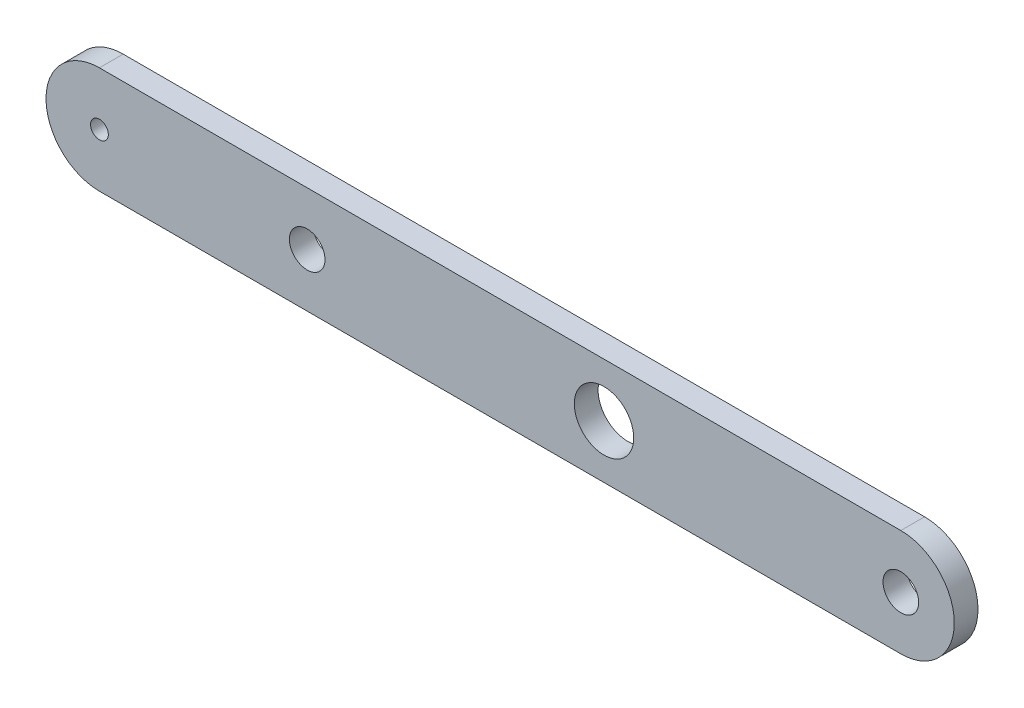
ISO-10303-21;
HEADER;
FILE_DESCRIPTION(('STEP AP214'),'2;1');
FILE_NAME('part.step','',(''),(''),'','','');
FILE_SCHEMA(('AUTOMOTIVE_DESIGN { 1 0 10303 214 1 1 1 1 }'));
ENDSEC;
DATA;
#1=APPLICATION_CONTEXT('core data for automotive mechanical design processes');
#2=APPLICATION_PROTOCOL_DEFINITION('international standard','automotive_design',2000,#1);
#3=PRODUCT_CONTEXT('',#1,'mechanical');
#4=PRODUCT('Part','Part','',(#3));
#5=PRODUCT_RELATED_PRODUCT_CATEGORY('part','',(#4));
#6=PRODUCT_DEFINITION_FORMATION('','',#4);
#7=PRODUCT_DEFINITION_CONTEXT('part definition',#1,'design');
#8=PRODUCT_DEFINITION('design','',#6,#7);
#9=PRODUCT_DEFINITION_SHAPE('','',#8);
#10=(LENGTH_UNIT() NAMED_UNIT(*) SI_UNIT(.MILLI.,.METRE.));
#11=(NAMED_UNIT(*) PLANE_ANGLE_UNIT() SI_UNIT($,.RADIAN.));
#12=(NAMED_UNIT(*) SI_UNIT($,.STERADIAN.) SOLID_ANGLE_UNIT());
#13=UNCERTAINTY_MEASURE_WITH_UNIT(LENGTH_MEASURE(1.E-05),#10,'distance_accuracy_value','');
#14=(GEOMETRIC_REPRESENTATION_CONTEXT(3) GLOBAL_UNCERTAINTY_ASSIGNED_CONTEXT((#13)) GLOBAL_UNIT_ASSIGNED_CONTEXT((#10,
#11,#12)) REPRESENTATION_CONTEXT('',''));
#15=CARTESIAN_POINT('',(0.,0.,0.));
#16=DIRECTION('',(0.,0.,1.));
#17=DIRECTION('',(1.,0.,0.));
#18=AXIS2_PLACEMENT_3D('',#15,#16,#17);
#19=CARTESIAN_POINT('',(-35.,0.,4.));
#20=DIRECTION('',(0.,0.,1.));
#21=DIRECTION('',(1.,0.,0.));
#22=AXIS2_PLACEMENT_3D('',#19,#20,#21);
#23=PLANE('',#22);
#24=CARTESIAN_POINT('',(50.,0.,4.));
#25=DIRECTION('',(0.,0.,1.));
#26=DIRECTION('',(1.,0.,0.));
#27=AXIS2_PLACEMENT_3D('',#24,#25,#26);
#28=CIRCLE('',#27,5.);
#29=CARTESIAN_POINT('',(55.,0.,4.));
#30=VERTEX_POINT('',#29);
#31=EDGE_CURVE('E123',#30,#30,#28,.T.);
#32=ORIENTED_EDGE('',*,*,#31,.F.);
#33=EDGE_LOOP('',(#32));
#34=FACE_BOUND('',#33,.T.);
#35=CARTESIAN_POINT('',(100.,0.,4.));
#36=DIRECTION('',(0.,0.,1.));
#37=DIRECTION('',(1.,0.,0.));
#38=AXIS2_PLACEMENT_3D('',#35,#36,#37);
#39=CIRCLE('',#38,3.00000000000001);
#40=CARTESIAN_POINT('',(103.,0.,4.));
#41=VERTEX_POINT('',#40);
#42=EDGE_CURVE('E102',#41,#41,#39,.T.);
#43=ORIENTED_EDGE('',*,*,#42,.F.);
#44=EDGE_LOOP('',(#43));
#45=FACE_BOUND('',#44,.T.);
#46=CARTESIAN_POINT('',(-35.,0.,4.));
#47=DIRECTION('',(0.,0.,1.));
#48=DIRECTION('',(1.,0.,0.));
#49=AXIS2_PLACEMENT_3D('',#46,#47,#48);
#50=CIRCLE('',#49,9.);
#51=CARTESIAN_POINT('',(-35.,9.,4.));
#52=VERTEX_POINT('',#51);
#53=CARTESIAN_POINT('',(-35.,-9.,4.));
#54=VERTEX_POINT('',#53);
#55=EDGE_CURVE('E87',#52,#54,#50,.T.);
#56=ORIENTED_EDGE('',*,*,#55,.T.);
#57=DIRECTION('',(1.,0.,0.));
#58=VECTOR('',#57,1.);
#59=CARTESIAN_POINT('',(-35.,-9.,4.));
#60=LINE('',#59,#58);
#61=CARTESIAN_POINT('',(100.,-9.,4.));
#62=VERTEX_POINT('',#61);
#63=EDGE_CURVE('E82',#54,#62,#60,.T.);
#64=ORIENTED_EDGE('',*,*,#63,.T.);
#65=CARTESIAN_POINT('',(100.,0.,4.));
#66=DIRECTION('',(0.,0.,1.));
#67=DIRECTION('',(1.,0.,0.));
#68=AXIS2_PLACEMENT_3D('',#65,#66,#67);
#69=CIRCLE('',#68,9.);
#70=CARTESIAN_POINT('',(100.,9.,4.));
#71=VERTEX_POINT('',#70);
#72=EDGE_CURVE('E85',#62,#71,#69,.T.);
#73=ORIENTED_EDGE('',*,*,#72,.T.);
#74=DIRECTION('',(-1.,0.,0.));
#75=VECTOR('',#74,1.);
#76=CARTESIAN_POINT('',(-35.,9.,4.));
#77=LINE('',#76,#75);
#78=EDGE_CURVE('E52',#71,#52,#77,.T.);
#79=ORIENTED_EDGE('',*,*,#78,.T.);
#80=EDGE_LOOP('',(#56,#64,#73,#79));
#81=FACE_BOUND('',#80,.T.);
#82=CARTESIAN_POINT('',(0.,0.,4.));
#83=DIRECTION('',(0.,0.,1.));
#84=DIRECTION('',(1.,0.,0.));
#85=AXIS2_PLACEMENT_3D('',#82,#83,#84);
#86=CIRCLE('',#85,3.);
#87=CARTESIAN_POINT('',(3.,0.,4.));
#88=VERTEX_POINT('',#87);
#89=EDGE_CURVE('E117',#88,#88,#86,.T.);
#90=ORIENTED_EDGE('',*,*,#89,.F.);
#91=EDGE_LOOP('',(#90));
#92=FACE_BOUND('',#91,.T.);
#93=CARTESIAN_POINT('',(-35.,0.,4.));
#94=DIRECTION('',(0.,0.,1.));
#95=DIRECTION('',(1.,0.,0.));
#96=AXIS2_PLACEMENT_3D('',#93,#94,#95);
#97=CIRCLE('',#96,1.5);
#98=CARTESIAN_POINT('',(-33.5,0.,4.));
#99=VERTEX_POINT('',#98);
#100=EDGE_CURVE('E129',#99,#99,#97,.T.);
#101=ORIENTED_EDGE('',*,*,#100,.F.);
#102=EDGE_LOOP('',(#101));
#103=FACE_BOUND('',#102,.T.);
#104=ADVANCED_FACE('F35',(#34,#45,#81,#92,#103),#23,.T.);
#105=CARTESIAN_POINT('',(-35.,0.,0.));
#106=DIRECTION('',(0.,0.,1.));
#107=DIRECTION('',(1.,0.,0.));
#108=AXIS2_PLACEMENT_3D('',#105,#106,#107);
#109=PLANE('',#108);
#110=CARTESIAN_POINT('',(-35.,0.,0.));
#111=DIRECTION('',(0.,0.,1.));
#112=DIRECTION('',(1.,0.,0.));
#113=AXIS2_PLACEMENT_3D('',#110,#111,#112);
#114=CIRCLE('',#113,9.);
#115=CARTESIAN_POINT('',(-35.,9.,0.));
#116=VERTEX_POINT('',#115);
#117=CARTESIAN_POINT('',(-35.,-9.,0.));
#118=VERTEX_POINT('',#117);
#119=EDGE_CURVE('E99',#116,#118,#114,.T.);
#120=ORIENTED_EDGE('',*,*,#119,.F.);
#121=DIRECTION('',(-1.,0.,0.));
#122=VECTOR('',#121,1.);
#123=CARTESIAN_POINT('',(-35.,9.,0.));
#124=LINE('',#123,#122);
#125=CARTESIAN_POINT('',(100.,9.,0.));
#126=VERTEX_POINT('',#125);
#127=EDGE_CURVE('E75',#126,#116,#124,.T.);
#128=ORIENTED_EDGE('',*,*,#127,.F.);
#129=CARTESIAN_POINT('',(100.,0.,0.));
#130=DIRECTION('',(0.,0.,1.));
#131=DIRECTION('',(1.,0.,0.));
#132=AXIS2_PLACEMENT_3D('',#129,#130,#131);
#133=CIRCLE('',#132,9.);
#134=CARTESIAN_POINT('',(100.,-9.,0.));
#135=VERTEX_POINT('',#134);
#136=EDGE_CURVE('E69',#135,#126,#133,.T.);
#137=ORIENTED_EDGE('',*,*,#136,.F.);
#138=DIRECTION('',(1.,0.,0.));
#139=VECTOR('',#138,1.);
#140=CARTESIAN_POINT('',(-35.,-9.,0.));
#141=LINE('',#140,#139);
#142=EDGE_CURVE('E91',#118,#135,#141,.T.);
#143=ORIENTED_EDGE('',*,*,#142,.F.);
#144=EDGE_LOOP('',(#120,#128,#137,#143));
#145=FACE_BOUND('',#144,.T.);
#146=CARTESIAN_POINT('',(100.,0.,0.));
#147=DIRECTION('',(0.,0.,1.));
#148=DIRECTION('',(1.,0.,0.));
#149=AXIS2_PLACEMENT_3D('',#146,#147,#148);
#150=CIRCLE('',#149,3.00000000000001);
#151=CARTESIAN_POINT('',(103.,0.,0.));
#152=VERTEX_POINT('',#151);
#153=EDGE_CURVE('E114',#152,#152,#150,.T.);
#154=ORIENTED_EDGE('',*,*,#153,.T.);
#155=EDGE_LOOP('',(#154));
#156=FACE_BOUND('',#155,.T.);
#157=CARTESIAN_POINT('',(0.,0.,0.));
#158=DIRECTION('',(0.,0.,1.));
#159=DIRECTION('',(1.,0.,0.));
#160=AXIS2_PLACEMENT_3D('',#157,#158,#159);
#161=CIRCLE('',#160,3.);
#162=CARTESIAN_POINT('',(3.,0.,0.));
#163=VERTEX_POINT('',#162);
#164=EDGE_CURVE('E120',#163,#163,#161,.T.);
#165=ORIENTED_EDGE('',*,*,#164,.T.);
#166=EDGE_LOOP('',(#165));
#167=FACE_BOUND('',#166,.T.);
#168=CARTESIAN_POINT('',(50.,0.,0.));
#169=DIRECTION('',(0.,0.,1.));
#170=DIRECTION('',(1.,0.,0.));
#171=AXIS2_PLACEMENT_3D('',#168,#169,#170);
#172=CIRCLE('',#171,5.);
#173=CARTESIAN_POINT('',(55.,0.,0.));
#174=VERTEX_POINT('',#173);
#175=EDGE_CURVE('E126',#174,#174,#172,.T.);
#176=ORIENTED_EDGE('',*,*,#175,.T.);
#177=EDGE_LOOP('',(#176));
#178=FACE_BOUND('',#177,.T.);
#179=CARTESIAN_POINT('',(-35.,0.,0.));
#180=DIRECTION('',(0.,0.,1.));
#181=DIRECTION('',(1.,0.,0.));
#182=AXIS2_PLACEMENT_3D('',#179,#180,#181);
#183=CIRCLE('',#182,1.5);
#184=CARTESIAN_POINT('',(-33.5,0.,0.));
#185=VERTEX_POINT('',#184);
#186=EDGE_CURVE('E132',#185,#185,#183,.T.);
#187=ORIENTED_EDGE('',*,*,#186,.T.);
#188=EDGE_LOOP('',(#187));
#189=FACE_BOUND('',#188,.T.);
#190=ADVANCED_FACE('F110',(#145,#156,#167,#178,#189),#109,.F.);
#191=CARTESIAN_POINT('',(-35.,0.,4.));
#192=DIRECTION('',(0.,0.,-1.));
#193=DIRECTION('',(-1.,0.,0.));
#194=AXIS2_PLACEMENT_3D('',#191,#192,#193);
#195=CYLINDRICAL_SURFACE('',#194,9.);
#196=ORIENTED_EDGE('',*,*,#119,.T.);
#197=DIRECTION('',(0.,0.,-1.));
#198=VECTOR('',#197,1.);
#199=CARTESIAN_POINT('',(-35.,-9.,4.));
#200=LINE('',#199,#198);
#201=EDGE_CURVE('E11',#54,#118,#200,.T.);
#202=ORIENTED_EDGE('',*,*,#201,.F.);
#203=ORIENTED_EDGE('',*,*,#55,.F.);
#204=DIRECTION('',(0.,0.,-1.));
#205=VECTOR('',#204,1.);
#206=CARTESIAN_POINT('',(-35.,9.,4.));
#207=LINE('',#206,#205);
#208=EDGE_CURVE('E95',#52,#116,#207,.T.);
#209=ORIENTED_EDGE('',*,*,#208,.T.);
#210=EDGE_LOOP('',(#196,#202,#203,#209));
#211=FACE_BOUND('',#210,.T.);
#212=ADVANCED_FACE('F37',(#211),#195,.T.);
#213=CARTESIAN_POINT('',(-35.,-9.,4.));
#214=DIRECTION('',(0.,1.,0.));
#215=DIRECTION('',(-1.,0.,0.));
#216=AXIS2_PLACEMENT_3D('',#213,#214,#215);
#217=PLANE('',#216);
#218=ORIENTED_EDGE('',*,*,#142,.T.);
#219=DIRECTION('',(0.,0.,-1.));
#220=VECTOR('',#219,1.);
#221=CARTESIAN_POINT('',(100.,-9.,4.));
#222=LINE('',#221,#220);
#223=EDGE_CURVE('E44',#62,#135,#222,.T.);
#224=ORIENTED_EDGE('',*,*,#223,.F.);
#225=ORIENTED_EDGE('',*,*,#63,.F.);
#226=ORIENTED_EDGE('',*,*,#201,.T.);
#227=EDGE_LOOP('',(#218,#224,#225,#226));
#228=FACE_BOUND('',#227,.T.);
#229=ADVANCED_FACE('F90',(#228),#217,.F.);
#230=CARTESIAN_POINT('',(100.,0.,4.));
#231=DIRECTION('',(0.,0.,-1.));
#232=DIRECTION('',(-1.,0.,0.));
#233=AXIS2_PLACEMENT_3D('',#230,#231,#232);
#234=CYLINDRICAL_SURFACE('',#233,9.);
#235=ORIENTED_EDGE('',*,*,#136,.T.);
#236=DIRECTION('',(0.,0.,-1.));
#237=VECTOR('',#236,1.);
#238=CARTESIAN_POINT('',(100.,9.,4.));
#239=LINE('',#238,#237);
#240=EDGE_CURVE('E92',#71,#126,#239,.T.);
#241=ORIENTED_EDGE('',*,*,#240,.F.);
#242=ORIENTED_EDGE('',*,*,#72,.F.);
#243=ORIENTED_EDGE('',*,*,#223,.T.);
#244=EDGE_LOOP('',(#235,#241,#242,#243));
#245=FACE_BOUND('',#244,.T.);
#246=ADVANCED_FACE('F93',(#245),#234,.T.);
#247=CARTESIAN_POINT('',(-35.,9.,4.));
#248=DIRECTION('',(0.,-1.,0.));
#249=DIRECTION('',(1.,0.,0.));
#250=AXIS2_PLACEMENT_3D('',#247,#248,#249);
#251=PLANE('',#250);
#252=ORIENTED_EDGE('',*,*,#127,.T.);
#253=ORIENTED_EDGE('',*,*,#208,.F.);
#254=ORIENTED_EDGE('',*,*,#78,.F.);
#255=ORIENTED_EDGE('',*,*,#240,.T.);
#256=EDGE_LOOP('',(#252,#253,#254,#255));
#257=FACE_BOUND('',#256,.T.);
#258=ADVANCED_FACE('F107',(#257),#251,.F.);
#259=CARTESIAN_POINT('',(100.,0.,4.));
#260=DIRECTION('',(0.,0.,-1.));
#261=DIRECTION('',(-1.,0.,0.));
#262=AXIS2_PLACEMENT_3D('',#259,#260,#261);
#263=CYLINDRICAL_SURFACE('',#262,3.00000000000001);
#264=ORIENTED_EDGE('',*,*,#42,.T.);
#265=EDGE_LOOP('',(#264));
#266=FACE_BOUND('',#265,.T.);
#267=ORIENTED_EDGE('',*,*,#153,.F.);
#268=EDGE_LOOP('',(#267));
#269=FACE_BOUND('',#268,.T.);
#270=ADVANCED_FACE('F151',(#266,#269),#263,.F.);
#271=CARTESIAN_POINT('',(0.,0.,4.));
#272=DIRECTION('',(0.,0.,-1.));
#273=DIRECTION('',(-1.,0.,0.));
#274=AXIS2_PLACEMENT_3D('',#271,#272,#273);
#275=CYLINDRICAL_SURFACE('',#274,3.);
#276=ORIENTED_EDGE('',*,*,#89,.T.);
#277=EDGE_LOOP('',(#276));
#278=FACE_BOUND('',#277,.T.);
#279=ORIENTED_EDGE('',*,*,#164,.F.);
#280=EDGE_LOOP('',(#279));
#281=FACE_BOUND('',#280,.T.);
#282=ADVANCED_FACE('F197',(#278,#281),#275,.F.);
#283=CARTESIAN_POINT('',(50.,0.,4.));
#284=DIRECTION('',(0.,0.,-1.));
#285=DIRECTION('',(-1.,0.,0.));
#286=AXIS2_PLACEMENT_3D('',#283,#284,#285);
#287=CYLINDRICAL_SURFACE('',#286,5.);
#288=ORIENTED_EDGE('',*,*,#31,.T.);
#289=EDGE_LOOP('',(#288));
#290=FACE_BOUND('',#289,.T.);
#291=ORIENTED_EDGE('',*,*,#175,.F.);
#292=EDGE_LOOP('',(#291));
#293=FACE_BOUND('',#292,.T.);
#294=ADVANCED_FACE('F205',(#290,#293),#287,.F.);
#295=CARTESIAN_POINT('',(-35.,0.,4.));
#296=DIRECTION('',(0.,0.,-1.));
#297=DIRECTION('',(-1.,0.,0.));
#298=AXIS2_PLACEMENT_3D('',#295,#296,#297);
#299=CYLINDRICAL_SURFACE('',#298,1.5);
#300=ORIENTED_EDGE('',*,*,#100,.T.);
#301=EDGE_LOOP('',(#300));
#302=FACE_BOUND('',#301,.T.);
#303=ORIENTED_EDGE('',*,*,#186,.F.);
#304=EDGE_LOOP('',(#303));
#305=FACE_BOUND('',#304,.T.);
#306=ADVANCED_FACE('F138',(#302,#305),#299,.F.);
#307=CLOSED_SHELL('',(#104,#190,#212,#229,#246,#258,#270,#282,#294,#306));
#308=MANIFOLD_SOLID_BREP('B2',#307);
#309=ADVANCED_BREP_SHAPE_REPRESENTATION('',(#18,#308),#14);
#310=SHAPE_DEFINITION_REPRESENTATION(#9,#309);
ENDSEC;
END-ISO-10303-21;
